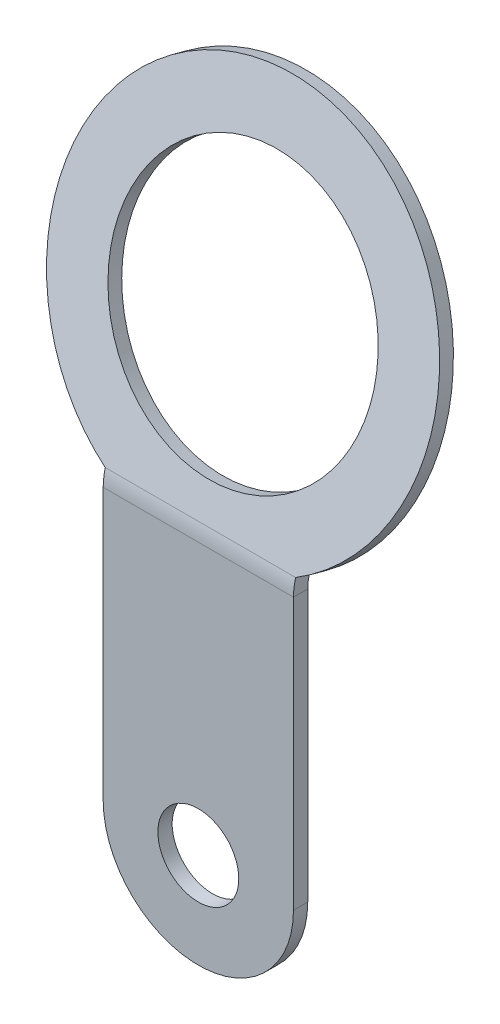
ISO-10303-21;
HEADER;
FILE_DESCRIPTION(('STEP AP214'),'2;1');
FILE_NAME('part.step','',(''),(''),'','','');
FILE_SCHEMA(('AUTOMOTIVE_DESIGN { 1 0 10303 214 1 1 1 1 }'));
ENDSEC;
DATA;
#1=APPLICATION_CONTEXT('core data for automotive mechanical design processes');
#2=APPLICATION_PROTOCOL_DEFINITION('international standard','automotive_design',2000,#1);
#3=PRODUCT_CONTEXT('',#1,'mechanical');
#4=PRODUCT('Part','Part','',(#3));
#5=PRODUCT_RELATED_PRODUCT_CATEGORY('part','',(#4));
#6=PRODUCT_DEFINITION_FORMATION('','',#4);
#7=PRODUCT_DEFINITION_CONTEXT('part definition',#1,'design');
#8=PRODUCT_DEFINITION('design','',#6,#7);
#9=PRODUCT_DEFINITION_SHAPE('','',#8);
#10=(LENGTH_UNIT() NAMED_UNIT(*) SI_UNIT(.MILLI.,.METRE.));
#11=(NAMED_UNIT(*) PLANE_ANGLE_UNIT() SI_UNIT($,.RADIAN.));
#12=(NAMED_UNIT(*) SI_UNIT($,.STERADIAN.) SOLID_ANGLE_UNIT());
#13=UNCERTAINTY_MEASURE_WITH_UNIT(LENGTH_MEASURE(1.E-05),#10,'distance_accuracy_value','');
#14=(GEOMETRIC_REPRESENTATION_CONTEXT(3) GLOBAL_UNCERTAINTY_ASSIGNED_CONTEXT((#13)) GLOBAL_UNIT_ASSIGNED_CONTEXT((#10,
#11,#12)) REPRESENTATION_CONTEXT('',''));
#15=CARTESIAN_POINT('',(0.,0.,0.));
#16=DIRECTION('',(0.,0.,1.));
#17=DIRECTION('',(1.,0.,0.));
#18=AXIS2_PLACEMENT_3D('',#15,#16,#17);
#19=CARTESIAN_POINT('',(0.,-0.0801251078382139,-0.615186445858677));
#20=DIRECTION('',(0.,0.258819045102521,0.965925826289068));
#21=DIRECTION('',(1.,0.,0.));
#22=AXIS2_PLACEMENT_3D('',#19,#20,#21);
#23=CYLINDRICAL_SURFACE('',#22,2.);
#24=CARTESIAN_POINT('',(0.,-0.0413022510728357,-0.470297571915317));
#25=DIRECTION('',(0.,0.258819045102521,0.965925826289068));
#26=DIRECTION('',(1.,0.,0.));
#27=AXIS2_PLACEMENT_3D('',#24,#25,#26);
#28=CIRCLE('',#27,2.);
#29=CARTESIAN_POINT('',(1.00092546630516,-1.71381842825224,-0.0221482129121059));
#30=VERTEX_POINT('',#29);
#31=CARTESIAN_POINT('',(-1.00092546630516,-1.71381842825224,-0.0221482129121059));
#32=VERTEX_POINT('',#31);
#33=EDGE_CURVE('E71',#30,#32,#28,.T.);
#34=ORIENTED_EDGE('',*,*,#33,.F.);
#35=CARTESIAN_POINT('',(1.00092546630516,-1.75264128501762,-0.167037086855466));
#36=CARTESIAN_POINT('',(1.00092546630516,-1.71381842825224,-0.0221482129121054));
#37=B_SPLINE_CURVE_WITH_KNOTS('',1,(#35,#36),.UNSPECIFIED.,.F.,.F.,(2,2),(0.,1.),.UNSPECIFIED.);
#38=CARTESIAN_POINT('',(1.00092546630516,-1.75264128501762,-0.167037086855466));
#39=VERTEX_POINT('',#38);
#40=EDGE_CURVE('E255',#30,#39,#37,.F.);
#41=ORIENTED_EDGE('',*,*,#40,.T.);
#42=CARTESIAN_POINT('',(0.,-0.0801251078382139,-0.615186445858677));
#43=DIRECTION('',(0.,0.258819045102521,0.965925826289068));
#44=DIRECTION('',(1.,0.,0.));
#45=AXIS2_PLACEMENT_3D('',#42,#43,#44);
#46=CIRCLE('',#45,2.);
#47=CARTESIAN_POINT('',(-1.00092546630516,-1.75264128501762,-0.167037086855466));
#48=VERTEX_POINT('',#47);
#49=EDGE_CURVE('E327',#39,#48,#46,.T.);
#50=ORIENTED_EDGE('',*,*,#49,.T.);
#51=CARTESIAN_POINT('',(-1.00092546630516,-1.71381842825224,-0.0221482129121056));
#52=CARTESIAN_POINT('',(-1.00092546630516,-1.75264128501762,-0.167037086855466));
#53=B_SPLINE_CURVE_WITH_KNOTS('',1,(#51,#52),.UNSPECIFIED.,.F.,.F.,(2,2),(0.,1.),.UNSPECIFIED.);
#54=EDGE_CURVE('E12',#48,#32,#53,.F.);
#55=ORIENTED_EDGE('',*,*,#54,.T.);
#56=EDGE_LOOP('',(#34,#41,#50,#55));
#57=FACE_BOUND('',#56,.T.);
#58=ADVANCED_FACE('F55',(#57),#23,.T.);
#59=CARTESIAN_POINT('',(0.,-4.61211233741566,0.754447299476275));
#60=DIRECTION('',(0.,0.258819045102521,0.965925826289068));
#61=DIRECTION('',(1.,0.,0.));
#62=AXIS2_PLACEMENT_3D('',#59,#60,#61);
#63=PLANE('',#62);
#64=CARTESIAN_POINT('',(0.,-0.0413022510728357,-0.470297571915317));
#65=DIRECTION('',(0.,0.258819045102521,0.965925826289068));
#66=DIRECTION('',(1.,0.,0.));
#67=AXIS2_PLACEMENT_3D('',#64,#65,#66);
#68=CIRCLE('',#67,1.375);
#69=CARTESIAN_POINT('',(1.375,-0.0413022510728357,-0.470297571915317));
#70=VERTEX_POINT('',#69);
#71=EDGE_CURVE('E323',#70,#70,#68,.T.);
#72=ORIENTED_EDGE('',*,*,#71,.F.);
#73=EDGE_LOOP('',(#72));
#74=FACE_BOUND('',#73,.T.);
#75=ORIENTED_EDGE('',*,*,#33,.T.);
#76=DIRECTION('',(1.,0.,0.));
#77=VECTOR('',#76,1.);
#78=CARTESIAN_POINT('',(0.,-1.71381842825224,-0.0221482129121057));
#79=LINE('',#78,#77);
#80=EDGE_CURVE('E65',#32,#30,#79,.T.);
#81=ORIENTED_EDGE('',*,*,#80,.T.);
#82=EDGE_LOOP('',(#75,#81));
#83=FACE_BOUND('',#82,.T.);
#84=ADVANCED_FACE('F57',(#74,#83),#63,.T.);
#85=CARTESIAN_POINT('',(0.,-4.65093519418103,0.609558425532915));
#86=DIRECTION('',(0.,0.258819045102521,0.965925826289068));
#87=DIRECTION('',(1.,0.,0.));
#88=AXIS2_PLACEMENT_3D('',#85,#86,#87);
#89=PLANE('',#88);
#90=DIRECTION('',(1.,0.,0.));
#91=VECTOR('',#90,1.);
#92=CARTESIAN_POINT('',(0.,-1.75264128501762,-0.167037086855466));
#93=LINE('',#92,#91);
#94=EDGE_CURVE('E273',#48,#39,#93,.T.);
#95=ORIENTED_EDGE('',*,*,#94,.F.);
#96=ORIENTED_EDGE('',*,*,#49,.F.);
#97=EDGE_LOOP('',(#95,#96));
#98=FACE_BOUND('',#97,.T.);
#99=CARTESIAN_POINT('',(0.,-0.0801251078382139,-0.615186445858677));
#100=DIRECTION('',(0.,0.258819045102521,0.965925826289068));
#101=DIRECTION('',(1.,0.,0.));
#102=AXIS2_PLACEMENT_3D('',#99,#100,#101);
#103=CIRCLE('',#102,1.375);
#104=CARTESIAN_POINT('',(1.375,-0.0801251078382139,-0.615186445858677));
#105=VERTEX_POINT('',#104);
#106=EDGE_CURVE('E320',#105,#105,#103,.T.);
#107=ORIENTED_EDGE('',*,*,#106,.T.);
#108=EDGE_LOOP('',(#107));
#109=FACE_BOUND('',#108,.T.);
#110=ADVANCED_FACE('F347',(#98,#109),#89,.F.);
#111=CARTESIAN_POINT('',(0.,-0.0801251078382139,-0.615186445858677));
#112=DIRECTION('',(0.,0.258819045102521,0.965925826289068));
#113=DIRECTION('',(1.,0.,0.));
#114=AXIS2_PLACEMENT_3D('',#111,#112,#113);
#115=CYLINDRICAL_SURFACE('',#114,1.375);
#116=ORIENTED_EDGE('',*,*,#106,.F.);
#117=EDGE_LOOP('',(#116));
#118=FACE_BOUND('',#117,.T.);
#119=ORIENTED_EDGE('',*,*,#71,.T.);
#120=EDGE_LOOP('',(#119));
#121=FACE_BOUND('',#120,.T.);
#122=ADVANCED_FACE('F351',(#118,#121),#115,.F.);
#123=CARTESIAN_POINT('',(0.,-4.73205080756888,-0.15));
#124=DIRECTION('',(0.,0.,1.));
#125=DIRECTION('',(1.,0.,0.));
#126=AXIS2_PLACEMENT_3D('',#123,#124,#125);
#127=CYLINDRICAL_SURFACE('',#126,1.);
#128=CARTESIAN_POINT('',(0.,-4.73205080756888,0.));
#129=DIRECTION('',(0.,0.,1.));
#130=DIRECTION('',(1.,0.,0.));
#131=AXIS2_PLACEMENT_3D('',#128,#129,#130);
#132=CIRCLE('',#131,1.);
#133=CARTESIAN_POINT('',(-1.,-4.73205080756888,0.));
#134=VERTEX_POINT('',#133);
#135=CARTESIAN_POINT('',(1.,-4.73205080756888,0.));
#136=VERTEX_POINT('',#135);
#137=EDGE_CURVE('E402',#134,#136,#132,.T.);
#138=ORIENTED_EDGE('',*,*,#137,.F.);
#139=DIRECTION('',(0.,0.,1.));
#140=VECTOR('',#139,1.);
#141=CARTESIAN_POINT('',(-1.,-4.73205080756888,-0.15));
#142=LINE('',#141,#140);
#143=CARTESIAN_POINT('',(-1.,-4.73205080756888,-0.15));
#144=VERTEX_POINT('',#143);
#145=EDGE_CURVE('E326',#144,#134,#142,.T.);
#146=ORIENTED_EDGE('',*,*,#145,.F.);
#147=CARTESIAN_POINT('',(0.,-4.73205080756888,-0.15));
#148=DIRECTION('',(0.,0.,1.));
#149=DIRECTION('',(1.,0.,0.));
#150=AXIS2_PLACEMENT_3D('',#147,#148,#149);
#151=CIRCLE('',#150,1.);
#152=CARTESIAN_POINT('',(1.,-4.73205080756888,-0.15));
#153=VERTEX_POINT('',#152);
#154=EDGE_CURVE('E310',#144,#153,#151,.T.);
#155=ORIENTED_EDGE('',*,*,#154,.T.);
#156=DIRECTION('',(0.,0.,1.));
#157=VECTOR('',#156,1.);
#158=CARTESIAN_POINT('',(1.,-4.73205080756888,-0.15));
#159=LINE('',#158,#157);
#160=EDGE_CURVE('E314',#153,#136,#159,.T.);
#161=ORIENTED_EDGE('',*,*,#160,.T.);
#162=EDGE_LOOP('',(#138,#146,#155,#161));
#163=FACE_BOUND('',#162,.T.);
#164=ADVANCED_FACE('F355',(#163),#127,.T.);
#165=CARTESIAN_POINT('',(0.,-4.73205080756888,-0.15));
#166=DIRECTION('',(0.,0.,1.));
#167=DIRECTION('',(1.,0.,0.));
#168=AXIS2_PLACEMENT_3D('',#165,#166,#167);
#169=CYLINDRICAL_SURFACE('',#168,0.425);
#170=CARTESIAN_POINT('',(0.,-4.73205080756888,-0.15));
#171=DIRECTION('',(0.,0.,1.));
#172=DIRECTION('',(1.,0.,0.));
#173=AXIS2_PLACEMENT_3D('',#170,#171,#172);
#174=CIRCLE('',#173,0.425);
#175=CARTESIAN_POINT('',(0.425,-4.73205080756888,-0.15));
#176=VERTEX_POINT('',#175);
#177=EDGE_CURVE('E410',#176,#176,#174,.T.);
#178=ORIENTED_EDGE('',*,*,#177,.F.);
#179=EDGE_LOOP('',(#178));
#180=FACE_BOUND('',#179,.T.);
#181=CARTESIAN_POINT('',(0.,-4.73205080756888,0.));
#182=DIRECTION('',(0.,0.,1.));
#183=DIRECTION('',(1.,0.,0.));
#184=AXIS2_PLACEMENT_3D('',#181,#182,#183);
#185=CIRCLE('',#184,0.425);
#186=CARTESIAN_POINT('',(0.425,-4.73205080756888,0.));
#187=VERTEX_POINT('',#186);
#188=EDGE_CURVE('E413',#187,#187,#185,.T.);
#189=ORIENTED_EDGE('',*,*,#188,.T.);
#190=EDGE_LOOP('',(#189));
#191=FACE_BOUND('',#190,.T.);
#192=ADVANCED_FACE('F371',(#180,#191),#169,.F.);
#193=CARTESIAN_POINT('',(0.,-4.73205080756888,-0.15));
#194=DIRECTION('',(0.,0.,1.));
#195=DIRECTION('',(1.,0.,0.));
#196=AXIS2_PLACEMENT_3D('',#193,#194,#195);
#197=PLANE('',#196);
#198=ORIENTED_EDGE('',*,*,#177,.T.);
#199=EDGE_LOOP('',(#198));
#200=FACE_BOUND('',#199,.T.);
#201=DIRECTION('',(0.,-1.,0.));
#202=VECTOR('',#201,1.);
#203=CARTESIAN_POINT('',(-1.,-4.73205080756888,-0.15));
#204=LINE('',#203,#202);
#205=CARTESIAN_POINT('',(-1.,-1.88205080756888,-0.15));
#206=VERTEX_POINT('',#205);
#207=EDGE_CURVE('E398',#206,#144,#204,.T.);
#208=ORIENTED_EDGE('',*,*,#207,.F.);
#209=DIRECTION('',(1.,0.,0.));
#210=VECTOR('',#209,1.);
#211=CARTESIAN_POINT('',(0.,-1.88205080756888,-0.15));
#212=LINE('',#211,#210);
#213=CARTESIAN_POINT('',(1.,-1.88205080756888,-0.15));
#214=VERTEX_POINT('',#213);
#215=EDGE_CURVE('E152',#206,#214,#212,.T.);
#216=ORIENTED_EDGE('',*,*,#215,.T.);
#217=DIRECTION('',(0.,1.,0.));
#218=VECTOR('',#217,1.);
#219=CARTESIAN_POINT('',(1.,-4.73205080756888,-0.15));
#220=LINE('',#219,#218);
#221=EDGE_CURVE('E407',#153,#214,#220,.T.);
#222=ORIENTED_EDGE('',*,*,#221,.F.);
#223=ORIENTED_EDGE('',*,*,#154,.F.);
#224=EDGE_LOOP('',(#208,#216,#222,#223));
#225=FACE_BOUND('',#224,.T.);
#226=ADVANCED_FACE('F368',(#200,#225),#197,.F.);
#227=CARTESIAN_POINT('',(1.,-4.73205080756888,-0.15));
#228=DIRECTION('',(1.,0.,0.));
#229=DIRECTION('',(0.,0.,-1.));
#230=AXIS2_PLACEMENT_3D('',#227,#228,#229);
#231=PLANE('',#230);
#232=DIRECTION('',(0.,0.,-1.));
#233=VECTOR('',#232,1.);
#234=CARTESIAN_POINT('',(1.,-1.88205080756888,-0.15));
#235=LINE('',#234,#233);
#236=CARTESIAN_POINT('',(1.,-1.88205080756888,0.));
#237=VERTEX_POINT('',#236);
#238=EDGE_CURVE('E307',#237,#214,#235,.T.);
#239=ORIENTED_EDGE('',*,*,#238,.F.);
#240=DIRECTION('',(0.,1.,0.));
#241=VECTOR('',#240,1.);
#242=CARTESIAN_POINT('',(1.,-4.73205080756888,0.));
#243=LINE('',#242,#241);
#244=EDGE_CURVE('E400',#136,#237,#243,.T.);
#245=ORIENTED_EDGE('',*,*,#244,.F.);
#246=ORIENTED_EDGE('',*,*,#160,.F.);
#247=ORIENTED_EDGE('',*,*,#221,.T.);
#248=EDGE_LOOP('',(#239,#245,#246,#247));
#249=FACE_BOUND('',#248,.T.);
#250=ADVANCED_FACE('F364',(#249),#231,.T.);
#251=CARTESIAN_POINT('',(0.,-4.73205080756888,0.));
#252=DIRECTION('',(0.,0.,1.));
#253=DIRECTION('',(1.,0.,0.));
#254=AXIS2_PLACEMENT_3D('',#251,#252,#253);
#255=PLANE('',#254);
#256=DIRECTION('',(1.,0.,0.));
#257=VECTOR('',#256,1.);
#258=CARTESIAN_POINT('',(0.,-1.88205080756888,0.));
#259=LINE('',#258,#257);
#260=CARTESIAN_POINT('',(-1.,-1.88205080756888,0.));
#261=VERTEX_POINT('',#260);
#262=EDGE_CURVE('E311',#261,#237,#259,.T.);
#263=ORIENTED_EDGE('',*,*,#262,.F.);
#264=DIRECTION('',(0.,-1.,0.));
#265=VECTOR('',#264,1.);
#266=CARTESIAN_POINT('',(-1.,-4.73205080756888,0.));
#267=LINE('',#266,#265);
#268=EDGE_CURVE('E405',#261,#134,#267,.T.);
#269=ORIENTED_EDGE('',*,*,#268,.T.);
#270=ORIENTED_EDGE('',*,*,#137,.T.);
#271=ORIENTED_EDGE('',*,*,#244,.T.);
#272=EDGE_LOOP('',(#263,#269,#270,#271));
#273=FACE_BOUND('',#272,.T.);
#274=ORIENTED_EDGE('',*,*,#188,.F.);
#275=EDGE_LOOP('',(#274));
#276=FACE_BOUND('',#275,.T.);
#277=ADVANCED_FACE('F360',(#273,#276),#255,.T.);
#278=CARTESIAN_POINT('',(-1.,-4.73205080756888,-0.15));
#279=DIRECTION('',(-1.,0.,0.));
#280=DIRECTION('',(0.,0.,1.));
#281=AXIS2_PLACEMENT_3D('',#278,#279,#280);
#282=PLANE('',#281);
#283=DIRECTION('',(0.,0.,1.));
#284=VECTOR('',#283,1.);
#285=CARTESIAN_POINT('',(-1.,-1.88205080756888,-0.15));
#286=LINE('',#285,#284);
#287=EDGE_CURVE('E131',#206,#261,#286,.T.);
#288=ORIENTED_EDGE('',*,*,#287,.F.);
#289=ORIENTED_EDGE('',*,*,#207,.T.);
#290=ORIENTED_EDGE('',*,*,#145,.T.);
#291=ORIENTED_EDGE('',*,*,#268,.F.);
#292=EDGE_LOOP('',(#288,#289,#290,#291));
#293=FACE_BOUND('',#292,.T.);
#294=ADVANCED_FACE('F357',(#293),#282,.T.);
#295=CARTESIAN_POINT('',(-0.999999999999999,-1.71440229166208,-0.021992058080275));
#296=CARTESIAN_POINT('',(-1.00030853108542,-1.71420770969455,-0.022044002292922));
#297=CARTESIAN_POINT('',(-1.0006170198538,-1.71401308851414,-0.0220960538521314));
#298=CARTESIAN_POINT('',(-1.00092546630516,-1.71381842825224,-0.0221482129121056));
#299=CARTESIAN_POINT('',(-0.999999999999999,-1.7530904107175,-0.166916967754058));
#300=CARTESIAN_POINT('',(-1.00030853108542,-1.75294073228093,-0.166956924840709));
#301=CARTESIAN_POINT('',(-1.0006170198538,-1.75279102368062,-0.16699696450164));
#302=CARTESIAN_POINT('',(-1.00092546630516,-1.75264128501762,-0.167037086855466));
#303=B_SPLINE_SURFACE_WITH_KNOTS('',1,3,((#295,#296,#297,#298),(#299,#300,#301,#302)),
.UNSPECIFIED.,.F.,.F.,.F.,(2,2),(4,4),(0.,1.),(0.,1.),.UNSPECIFIED.);
#304=CARTESIAN_POINT('',(-0.999999999999999,-1.7530904107175,-0.166916967754058));
#305=CARTESIAN_POINT('',(-0.999999999999999,-1.71440229166208,-0.021992058080275));
#306=B_SPLINE_CURVE_WITH_KNOTS('',1,(#304,#305),.UNSPECIFIED.,.F.,.F.,(2,2),(0.,1.),.UNSPECIFIED.);
#307=CARTESIAN_POINT('',(-0.999999999999999,-1.71440229166208,-0.021992058080275));
#308=VERTEX_POINT('',#307);
#309=CARTESIAN_POINT('',(-0.999999999999999,-1.7530904107175,-0.166916967754058));
#310=VERTEX_POINT('',#309);
#311=EDGE_CURVE('E118',#308,#310,#306,.F.);
#312=CARTESIAN_POINT('',(-0.999999999999999,-1.71440229166208,-0.021992058080275));
#313=CARTESIAN_POINT('',(-1.00030853108542,-1.71420770969455,-0.022044002292922));
#314=CARTESIAN_POINT('',(-1.0006170198538,-1.71401308851414,-0.0220960538521314));
#315=CARTESIAN_POINT('',(-1.00092546630516,-1.71381842825224,-0.0221482129121056));
#316=B_SPLINE_CURVE_WITH_KNOTS('',3,(#312,#313,#314,#315),.UNSPECIFIED.,.F.,.F.,(4,4),(0.,1.),.UNSPECIFIED.);
#317=EDGE_CURVE('E163',#308,#32,#316,.T.);
#318=CARTESIAN_POINT('',(-1.00092546630516,-1.75264128501762,-0.167037086855466));
#319=CARTESIAN_POINT('',(-1.0006170198538,-1.75279102368062,-0.16699696450164));
#320=CARTESIAN_POINT('',(-1.00030853108542,-1.75294073228093,-0.166956924840709));
#321=CARTESIAN_POINT('',(-0.999999999999999,-1.7530904107175,-0.166916967754058));
#322=B_SPLINE_CURVE_WITH_KNOTS('',3,(#318,#319,#320,#321),.UNSPECIFIED.,.F.,.F.,(4,4),(0.,1.),.UNSPECIFIED.);
#323=EDGE_CURVE('E137',#310,#48,#322,.F.);
#324=ORIENTED_EDGE('',*,*,#311,.F.);
#325=ORIENTED_EDGE('',*,*,#317,.T.);
#326=ORIENTED_EDGE('',*,*,#54,.F.);
#327=ORIENTED_EDGE('',*,*,#323,.F.);
#328=EDGE_LOOP('',(#324,#325,#326,#327));
#329=FACE_BOUND('',#328,.T.);
#330=ADVANCED_FACE('F139',(#329),#303,.F.);
#331=CARTESIAN_POINT('',(1.00092546630516,-1.71381842825224,-0.0221482129121054));
#332=CARTESIAN_POINT('',(1.00061701985203,-1.71401308851526,-0.0220960538518309));
#333=CARTESIAN_POINT('',(1.00030853108364,-1.71420770969567,-0.0220440022926228));
#334=CARTESIAN_POINT('',(0.999999999999998,-1.71440229166208,-0.021992058080275));
#335=CARTESIAN_POINT('',(1.00092546630516,-1.75264128501762,-0.167037086855466));
#336=CARTESIAN_POINT('',(1.00061701985203,-1.75279102368148,-0.166996964501409));
#337=CARTESIAN_POINT('',(1.00030853108364,-1.75294073228179,-0.166956924840479));
#338=CARTESIAN_POINT('',(0.999999999999998,-1.7530904107175,-0.166916967754058));
#339=B_SPLINE_SURFACE_WITH_KNOTS('',1,3,((#331,#332,#333,#334),(#335,#336,#337,#338)),
.UNSPECIFIED.,.F.,.F.,.F.,(2,2),(4,4),(0.,1.),(0.,1.),.UNSPECIFIED.);
#340=CARTESIAN_POINT('',(1.00092546630516,-1.71381842825224,-0.0221482129121054));
#341=CARTESIAN_POINT('',(1.00061701985203,-1.71401308851526,-0.0220960538518309));
#342=CARTESIAN_POINT('',(1.00030853108364,-1.71420770969567,-0.0220440022926228));
#343=CARTESIAN_POINT('',(0.999999999999998,-1.71440229166208,-0.021992058080275));
#344=B_SPLINE_CURVE_WITH_KNOTS('',3,(#340,#341,#342,#343),.UNSPECIFIED.,.F.,.F.,(4,4),(0.,1.),.UNSPECIFIED.);
#345=CARTESIAN_POINT('',(0.999999999999998,-1.71440229166208,-0.021992058080275));
#346=VERTEX_POINT('',#345);
#347=EDGE_CURVE('E270',#30,#346,#344,.T.);
#348=CARTESIAN_POINT('',(0.999999999999998,-1.71440229166208,-0.021992058080275));
#349=CARTESIAN_POINT('',(0.999999999999998,-1.7530904107175,-0.166916967754058));
#350=B_SPLINE_CURVE_WITH_KNOTS('',1,(#348,#349),.UNSPECIFIED.,.F.,.F.,(2,2),(0.,1.),.UNSPECIFIED.);
#351=CARTESIAN_POINT('',(0.999999999999998,-1.7530904107175,-0.166916967754058));
#352=VERTEX_POINT('',#351);
#353=EDGE_CURVE('E132',#346,#352,#350,.T.);
#354=CARTESIAN_POINT('',(0.999999999999998,-1.7530904107175,-0.166916967754058));
#355=CARTESIAN_POINT('',(1.00030853108364,-1.75294073228179,-0.166956924840479));
#356=CARTESIAN_POINT('',(1.00061701985203,-1.75279102368148,-0.166996964501409));
#357=CARTESIAN_POINT('',(1.00092546630516,-1.75264128501762,-0.167037086855466));
#358=B_SPLINE_CURVE_WITH_KNOTS('',3,(#354,#355,#356,#357),.UNSPECIFIED.,.F.,.F.,(4,4),(0.,1.),.UNSPECIFIED.);
#359=EDGE_CURVE('E145',#39,#352,#358,.F.);
#360=ORIENTED_EDGE('',*,*,#40,.F.);
#361=ORIENTED_EDGE('',*,*,#347,.T.);
#362=ORIENTED_EDGE('',*,*,#353,.T.);
#363=ORIENTED_EDGE('',*,*,#359,.F.);
#364=EDGE_LOOP('',(#360,#361,#362,#363));
#365=FACE_BOUND('',#364,.T.);
#366=ADVANCED_FACE('F205',(#365),#339,.F.);
#367=CARTESIAN_POINT('',(1.,-1.88205080756888,-0.65));
#368=DIRECTION('',(-1.,0.,0.));
#369=DIRECTION('',(0.,0.,1.));
#370=AXIS2_PLACEMENT_3D('',#367,#368,#369);
#371=PLANE('',#370);
#372=ORIENTED_EDGE('',*,*,#353,.F.);
#373=CARTESIAN_POINT('',(0.999999999999998,-1.88205080756888,-0.65));
#374=DIRECTION('',(1.,0.,0.));
#375=DIRECTION('',(0.,1.,0.));
#376=AXIS2_PLACEMENT_3D('',#373,#374,#375);
#377=CIRCLE('',#376,0.65);
#378=EDGE_CURVE('E275',#346,#237,#377,.T.);
#379=ORIENTED_EDGE('',*,*,#378,.T.);
#380=ORIENTED_EDGE('',*,*,#238,.T.);
#381=CARTESIAN_POINT('',(1.,-1.88205080756888,-0.65));
#382=DIRECTION('',(1.,0.,0.));
#383=DIRECTION('',(0.,0.,1.));
#384=AXIS2_PLACEMENT_3D('',#381,#382,#383);
#385=CIRCLE('',#384,0.5);
#386=EDGE_CURVE('E153',#352,#214,#385,.T.);
#387=ORIENTED_EDGE('',*,*,#386,.F.);
#388=EDGE_LOOP('',(#372,#379,#380,#387));
#389=FACE_BOUND('',#388,.T.);
#390=ADVANCED_FACE('F179',(#389),#371,.F.);
#391=CARTESIAN_POINT('',(-1.,-1.88205080756888,-0.65));
#392=DIRECTION('',(1.,0.,0.));
#393=DIRECTION('',(0.,0.,-1.));
#394=AXIS2_PLACEMENT_3D('',#391,#392,#393);
#395=PLANE('',#394);
#396=CARTESIAN_POINT('',(-1.,-1.88205080756888,-0.65));
#397=DIRECTION('',(1.,0.,0.));
#398=DIRECTION('',(0.,1.,0.));
#399=AXIS2_PLACEMENT_3D('',#396,#397,#398);
#400=CIRCLE('',#399,0.65);
#401=EDGE_CURVE('E126',#261,#308,#400,.F.);
#402=ORIENTED_EDGE('',*,*,#401,.T.);
#403=ORIENTED_EDGE('',*,*,#311,.T.);
#404=CARTESIAN_POINT('',(-1.,-1.88205080756888,-0.65));
#405=DIRECTION('',(-1.,0.,0.));
#406=DIRECTION('',(0.,0.,-1.));
#407=AXIS2_PLACEMENT_3D('',#404,#405,#406);
#408=CIRCLE('',#407,0.5);
#409=EDGE_CURVE('E124',#206,#310,#408,.T.);
#410=ORIENTED_EDGE('',*,*,#409,.F.);
#411=ORIENTED_EDGE('',*,*,#287,.T.);
#412=EDGE_LOOP('',(#402,#403,#410,#411));
#413=FACE_BOUND('',#412,.T.);
#414=ADVANCED_FACE('F121',(#413),#395,.F.);
#415=CARTESIAN_POINT('',(-2.01309906279762,-1.88205080756888,-0.65));
#416=DIRECTION('',(1.,0.,0.));
#417=DIRECTION('',(0.,1.,0.));
#418=AXIS2_PLACEMENT_3D('',#415,#416,#417);
#419=CYLINDRICAL_SURFACE('',#418,0.5);
#420=ORIENTED_EDGE('',*,*,#215,.F.);
#421=ORIENTED_EDGE('',*,*,#409,.T.);
#422=ORIENTED_EDGE('',*,*,#323,.T.);
#423=ORIENTED_EDGE('',*,*,#94,.T.);
#424=ORIENTED_EDGE('',*,*,#359,.T.);
#425=ORIENTED_EDGE('',*,*,#386,.T.);
#426=EDGE_LOOP('',(#420,#421,#422,#423,#424,#425));
#427=FACE_BOUND('',#426,.T.);
#428=ADVANCED_FACE('F149',(#427),#419,.F.);
#429=CARTESIAN_POINT('',(-2.01309906279762,-1.88205080756888,-0.65));
#430=DIRECTION('',(1.,0.,0.));
#431=DIRECTION('',(0.,1.,0.));
#432=AXIS2_PLACEMENT_3D('',#429,#430,#431);
#433=CYLINDRICAL_SURFACE('',#432,0.65);
#434=ORIENTED_EDGE('',*,*,#262,.T.);
#435=ORIENTED_EDGE('',*,*,#378,.F.);
#436=ORIENTED_EDGE('',*,*,#347,.F.);
#437=ORIENTED_EDGE('',*,*,#80,.F.);
#438=ORIENTED_EDGE('',*,*,#317,.F.);
#439=ORIENTED_EDGE('',*,*,#401,.F.);
#440=EDGE_LOOP('',(#434,#435,#436,#437,#438,#439));
#441=FACE_BOUND('',#440,.T.);
#442=ADVANCED_FACE('F168',(#441),#433,.T.);
#443=CLOSED_SHELL('',(#58,#84,#110,#122,#164,#192,#226,#250,#277,#294,#330,#366,#390,#414,#428,#442));
#444=MANIFOLD_SOLID_BREP('B2',#443);
#445=ADVANCED_BREP_SHAPE_REPRESENTATION('',(#18,#444),#14);
#446=SHAPE_DEFINITION_REPRESENTATION(#9,#445);
ENDSEC;
END-ISO-10303-21;
